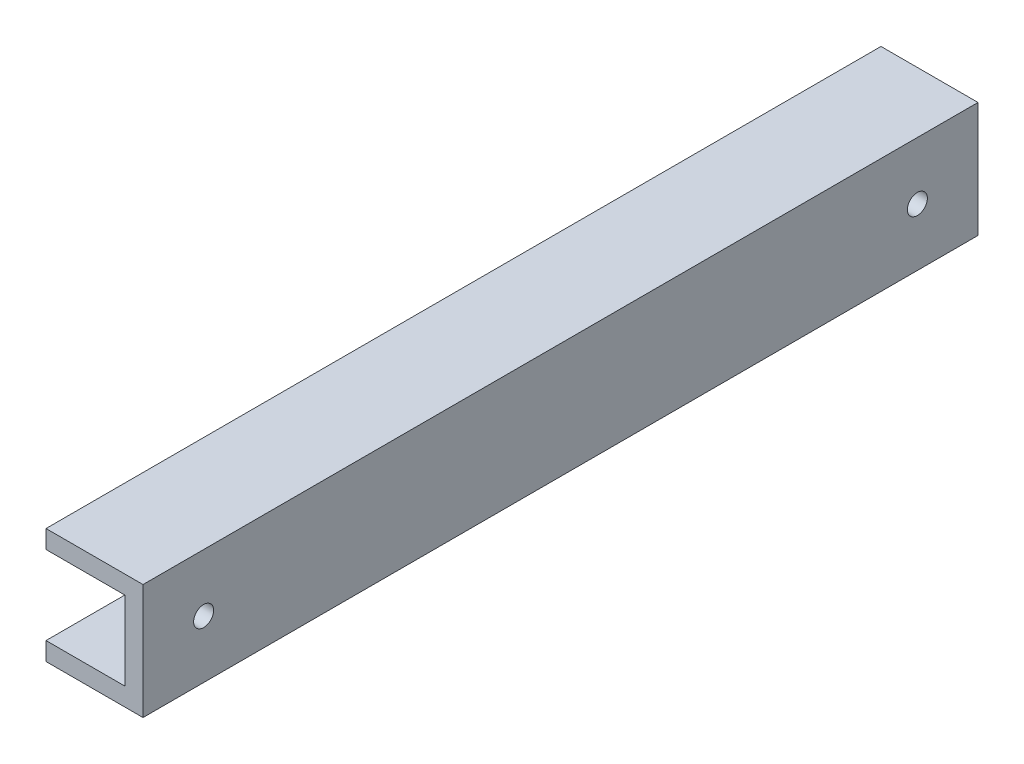
ISO-10303-21;
HEADER;
FILE_DESCRIPTION(('STEP AP214'),'2;1');
FILE_NAME('part.step','',(''),(''),'','','');
FILE_SCHEMA(('AUTOMOTIVE_DESIGN { 1 0 10303 214 1 1 1 1 }'));
ENDSEC;
DATA;
#1=APPLICATION_CONTEXT('core data for automotive mechanical design processes');
#2=APPLICATION_PROTOCOL_DEFINITION('international standard','automotive_design',2000,#1);
#3=PRODUCT_CONTEXT('',#1,'mechanical');
#4=PRODUCT('Part','Part','',(#3));
#5=PRODUCT_RELATED_PRODUCT_CATEGORY('part','',(#4));
#6=PRODUCT_DEFINITION_FORMATION('','',#4);
#7=PRODUCT_DEFINITION_CONTEXT('part definition',#1,'design');
#8=PRODUCT_DEFINITION('design','',#6,#7);
#9=PRODUCT_DEFINITION_SHAPE('','',#8);
#10=(LENGTH_UNIT() NAMED_UNIT(*) SI_UNIT(.MILLI.,.METRE.));
#11=(NAMED_UNIT(*) PLANE_ANGLE_UNIT() SI_UNIT($,.RADIAN.));
#12=(NAMED_UNIT(*) SI_UNIT($,.STERADIAN.) SOLID_ANGLE_UNIT());
#13=UNCERTAINTY_MEASURE_WITH_UNIT(LENGTH_MEASURE(1.E-05),#10,'distance_accuracy_value','');
#14=(GEOMETRIC_REPRESENTATION_CONTEXT(3) GLOBAL_UNCERTAINTY_ASSIGNED_CONTEXT((#13)) GLOBAL_UNIT_ASSIGNED_CONTEXT((#10,
#11,#12)) REPRESENTATION_CONTEXT('',''));
#15=CARTESIAN_POINT('',(0.,0.,0.));
#16=DIRECTION('',(0.,0.,1.));
#17=DIRECTION('',(1.,0.,0.));
#18=AXIS2_PLACEMENT_3D('',#15,#16,#17);
#19=CARTESIAN_POINT('',(3.,13.,23.));
#20=DIRECTION('',(0.,0.,1.));
#21=DIRECTION('',(0.,-1.,0.));
#22=AXIS2_PLACEMENT_3D('',#19,#20,#21);
#23=PLANE('',#22);
#24=DIRECTION('',(1.,0.,0.));
#25=VECTOR('',#24,1.);
#26=CARTESIAN_POINT('',(3.,13.,23.));
#27=LINE('',#26,#25);
#28=CARTESIAN_POINT('',(3.,13.,23.));
#29=VERTEX_POINT('',#28);
#30=CARTESIAN_POINT('',(9.,13.,23.));
#31=VERTEX_POINT('',#30);
#32=EDGE_CURVE('E237',#29,#31,#27,.T.);
#33=ORIENTED_EDGE('',*,*,#32,.T.);
#34=DIRECTION('',(0.,-1.,0.));
#35=VECTOR('',#34,1.);
#36=CARTESIAN_POINT('',(9.,13.,23.));
#37=LINE('',#36,#35);
#38=CARTESIAN_POINT('',(9.00000000000001,9.,23.));
#39=VERTEX_POINT('',#38);
#40=EDGE_CURVE('E71',#31,#39,#37,.T.);
#41=ORIENTED_EDGE('',*,*,#40,.T.);
#42=DIRECTION('',(-1.,0.,0.));
#43=VECTOR('',#42,1.);
#44=CARTESIAN_POINT('',(6.,9.,23.));
#45=LINE('',#44,#43);
#46=CARTESIAN_POINT('',(3.,9.,23.));
#47=VERTEX_POINT('',#46);
#48=EDGE_CURVE('E352',#39,#47,#45,.T.);
#49=ORIENTED_EDGE('',*,*,#48,.T.);
#50=DIRECTION('',(0.,-1.,0.));
#51=VECTOR('',#50,1.);
#52=CARTESIAN_POINT('',(3.,13.,23.));
#53=LINE('',#52,#51);
#54=EDGE_CURVE('E223',#29,#47,#53,.T.);
#55=ORIENTED_EDGE('',*,*,#54,.F.);
#56=EDGE_LOOP('',(#33,#41,#49,#55));
#57=FACE_BOUND('',#56,.T.);
#58=ADVANCED_FACE('F62',(#57),#23,.F.);
#59=CARTESIAN_POINT('',(3.,13.,114.7));
#60=DIRECTION('',(0.,0.,-1.));
#61=DIRECTION('',(-1.,0.,0.));
#62=AXIS2_PLACEMENT_3D('',#59,#60,#61);
#63=PLANE('',#62);
#64=DIRECTION('',(1.,0.,0.));
#65=VECTOR('',#64,1.);
#66=CARTESIAN_POINT('',(3.,0.,114.7));
#67=LINE('',#66,#65);
#68=CARTESIAN_POINT('',(3.,0.,114.7));
#69=VERTEX_POINT('',#68);
#70=CARTESIAN_POINT('',(9.,0.,114.7));
#71=VERTEX_POINT('',#70);
#72=EDGE_CURVE('E224',#69,#71,#67,.T.);
#73=ORIENTED_EDGE('',*,*,#72,.T.);
#74=DIRECTION('',(0.,1.,0.));
#75=VECTOR('',#74,1.);
#76=CARTESIAN_POINT('',(9.,13.,114.7));
#77=LINE('',#76,#75);
#78=CARTESIAN_POINT('',(9.00000000000002,4.,114.7));
#79=VERTEX_POINT('',#78);
#80=EDGE_CURVE('E334',#71,#79,#77,.T.);
#81=ORIENTED_EDGE('',*,*,#80,.T.);
#82=DIRECTION('',(-1.,0.,0.));
#83=VECTOR('',#82,1.);
#84=CARTESIAN_POINT('',(6.,4.,114.7));
#85=LINE('',#84,#83);
#86=CARTESIAN_POINT('',(3.,4.,114.7));
#87=VERTEX_POINT('',#86);
#88=EDGE_CURVE('E209',#79,#87,#85,.T.);
#89=ORIENTED_EDGE('',*,*,#88,.T.);
#90=DIRECTION('',(0.,1.,0.));
#91=VECTOR('',#90,1.);
#92=CARTESIAN_POINT('',(3.,13.,114.7));
#93=LINE('',#92,#91);
#94=EDGE_CURVE('E218',#69,#87,#93,.T.);
#95=ORIENTED_EDGE('',*,*,#94,.F.);
#96=EDGE_LOOP('',(#73,#81,#89,#95));
#97=FACE_BOUND('',#96,.T.);
#98=ADVANCED_FACE('F424',(#97),#63,.F.);
#99=CARTESIAN_POINT('',(3.,0.,0.));
#100=DIRECTION('',(-1.,0.,0.));
#101=DIRECTION('',(0.,0.,1.));
#102=AXIS2_PLACEMENT_3D('',#99,#100,#101);
#103=PLANE('',#102);
#104=DIRECTION('',(0.,0.,-1.));
#105=VECTOR('',#104,1.);
#106=CARTESIAN_POINT('',(3.,9.,23.));
#107=LINE('',#106,#105);
#108=CARTESIAN_POINT('',(3.,9.,114.7));
#109=VERTEX_POINT('',#108);
#110=EDGE_CURVE('E219',#109,#47,#107,.T.);
#111=ORIENTED_EDGE('',*,*,#110,.F.);
#112=CARTESIAN_POINT('',(3.,13.,114.7));
#113=VERTEX_POINT('',#112);
#114=EDGE_CURVE('E361',#109,#113,#93,.T.);
#115=ORIENTED_EDGE('',*,*,#114,.T.);
#116=DIRECTION('',(0.,0.,-1.));
#117=VECTOR('',#116,1.);
#118=CARTESIAN_POINT('',(3.,13.,23.));
#119=LINE('',#118,#117);
#120=EDGE_CURVE('E234',#113,#29,#119,.T.);
#121=ORIENTED_EDGE('',*,*,#120,.T.);
#122=ORIENTED_EDGE('',*,*,#54,.T.);
#123=EDGE_LOOP('',(#111,#115,#121,#122));
#124=FACE_BOUND('',#123,.T.);
#125=ADVANCED_FACE('F429',(#124),#103,.T.);
#126=CARTESIAN_POINT('',(0.,0.,137.7));
#127=DIRECTION('',(0.,1.,0.));
#128=DIRECTION('',(0.,0.,1.));
#129=AXIS2_PLACEMENT_3D('',#126,#127,#128);
#130=PLANE('',#129);
#131=DIRECTION('',(0.,0.,-1.));
#132=VECTOR('',#131,1.);
#133=CARTESIAN_POINT('',(13.,0.,137.7));
#134=LINE('',#133,#132);
#135=CARTESIAN_POINT('',(13.,0.,137.7));
#136=VERTEX_POINT('',#135);
#137=CARTESIAN_POINT('',(13.,0.,118.7));
#138=VERTEX_POINT('',#137);
#139=EDGE_CURVE('E285',#136,#138,#134,.T.);
#140=ORIENTED_EDGE('',*,*,#139,.T.);
#141=DIRECTION('',(-0.707106781186551,0.,-0.707106781186544));
#142=VECTOR('',#141,1.);
#143=CARTESIAN_POINT('',(15.9999999999999,0.,121.7));
#144=LINE('',#143,#142);
#145=EDGE_CURVE('E344',#138,#71,#144,.T.);
#146=ORIENTED_EDGE('',*,*,#145,.T.);
#147=ORIENTED_EDGE('',*,*,#72,.F.);
#148=DIRECTION('',(0.,0.,1.));
#149=VECTOR('',#148,1.);
#150=CARTESIAN_POINT('',(3.,0.,23.));
#151=LINE('',#150,#149);
#152=CARTESIAN_POINT('',(3.,0.,23.));
#153=VERTEX_POINT('',#152);
#154=EDGE_CURVE('E227',#153,#69,#151,.T.);
#155=ORIENTED_EDGE('',*,*,#154,.F.);
#156=DIRECTION('',(1.,0.,0.));
#157=VECTOR('',#156,1.);
#158=CARTESIAN_POINT('',(3.,0.,23.));
#159=LINE('',#158,#157);
#160=CARTESIAN_POINT('',(9.,0.,23.));
#161=VERTEX_POINT('',#160);
#162=EDGE_CURVE('E222',#153,#161,#159,.T.);
#163=ORIENTED_EDGE('',*,*,#162,.T.);
#164=DIRECTION('',(0.707106781186552,0.,-0.707106781186543));
#165=VECTOR('',#164,1.);
#166=CARTESIAN_POINT('',(-52.8500000000001,0.,84.8499999999993));
#167=LINE('',#166,#165);
#168=CARTESIAN_POINT('',(13.,0.,19.));
#169=VERTEX_POINT('',#168);
#170=EDGE_CURVE('E78',#161,#169,#167,.T.);
#171=ORIENTED_EDGE('',*,*,#170,.T.);
#172=CARTESIAN_POINT('',(13.,0.,0.));
#173=VERTEX_POINT('',#172);
#174=EDGE_CURVE('E284',#169,#173,#134,.T.);
#175=ORIENTED_EDGE('',*,*,#174,.T.);
#176=DIRECTION('',(1.,0.,0.));
#177=VECTOR('',#176,1.);
#178=CARTESIAN_POINT('',(0.,0.,0.));
#179=LINE('',#178,#177);
#180=CARTESIAN_POINT('',(0.,0.,0.));
#181=VERTEX_POINT('',#180);
#182=EDGE_CURVE('E260',#181,#173,#179,.T.);
#183=ORIENTED_EDGE('',*,*,#182,.F.);
#184=DIRECTION('',(0.,0.,-1.));
#185=VECTOR('',#184,1.);
#186=CARTESIAN_POINT('',(0.,0.,137.7));
#187=LINE('',#186,#185);
#188=CARTESIAN_POINT('',(0.,0.,137.7));
#189=VERTEX_POINT('',#188);
#190=EDGE_CURVE('E288',#189,#181,#187,.T.);
#191=ORIENTED_EDGE('',*,*,#190,.F.);
#192=DIRECTION('',(1.,0.,0.));
#193=VECTOR('',#192,1.);
#194=CARTESIAN_POINT('',(0.,0.,137.7));
#195=LINE('',#194,#193);
#196=EDGE_CURVE('E261',#189,#136,#195,.T.);
#197=ORIENTED_EDGE('',*,*,#196,.T.);
#198=EDGE_LOOP('',(#140,#146,#147,#155,#163,#171,#175,#183,#191,#197));
#199=FACE_BOUND('',#198,.T.);
#200=ADVANCED_FACE('F397',(#199),#130,.T.);
#201=CARTESIAN_POINT('',(13.,0.,137.7));
#202=DIRECTION('',(-1.,0.,0.));
#203=DIRECTION('',(0.,0.,1.));
#204=AXIS2_PLACEMENT_3D('',#201,#202,#203);
#205=PLANE('',#204);
#206=CARTESIAN_POINT('',(13.,6.5,127.7));
#207=DIRECTION('',(-1.,0.,0.));
#208=DIRECTION('',(0.,0.,1.));
#209=AXIS2_PLACEMENT_3D('',#206,#207,#208);
#210=CIRCLE('',#209,1.65000000000002);
#211=CARTESIAN_POINT('',(13.,6.5,129.35));
#212=VERTEX_POINT('',#211);
#213=EDGE_CURVE('E248',#212,#212,#210,.T.);
#214=ORIENTED_EDGE('',*,*,#213,.F.);
#215=EDGE_LOOP('',(#214));
#216=FACE_BOUND('',#215,.T.);
#217=DIRECTION('',(0.,0.,-1.));
#218=VECTOR('',#217,1.);
#219=CARTESIAN_POINT('',(13.,13.,137.7));
#220=LINE('',#219,#218);
#221=CARTESIAN_POINT('',(13.,13.,137.7));
#222=VERTEX_POINT('',#221);
#223=CARTESIAN_POINT('',(13.,13.,118.7));
#224=VERTEX_POINT('',#223);
#225=EDGE_CURVE('E281',#222,#224,#220,.T.);
#226=ORIENTED_EDGE('',*,*,#225,.T.);
#227=DIRECTION('',(0.,-1.,0.));
#228=VECTOR('',#227,1.);
#229=CARTESIAN_POINT('',(13.,0.,118.7));
#230=LINE('',#229,#228);
#231=EDGE_CURVE('E341',#224,#138,#230,.T.);
#232=ORIENTED_EDGE('',*,*,#231,.T.);
#233=ORIENTED_EDGE('',*,*,#139,.F.);
#234=DIRECTION('',(0.,1.,0.));
#235=VECTOR('',#234,1.);
#236=CARTESIAN_POINT('',(13.,0.,137.7));
#237=LINE('',#236,#235);
#238=EDGE_CURVE('E263',#136,#222,#237,.T.);
#239=ORIENTED_EDGE('',*,*,#238,.T.);
#240=EDGE_LOOP('',(#226,#232,#233,#239));
#241=FACE_BOUND('',#240,.T.);
#242=ADVANCED_FACE('F395',(#216,#241),#205,.T.);
#243=CARTESIAN_POINT('',(0.,13.,137.7));
#244=DIRECTION('',(0.,-1.,0.));
#245=DIRECTION('',(0.,0.,-1.));
#246=AXIS2_PLACEMENT_3D('',#243,#244,#245);
#247=PLANE('',#246);
#248=DIRECTION('',(1.,0.,0.));
#249=VECTOR('',#248,1.);
#250=CARTESIAN_POINT('',(3.,13.,114.7));
#251=LINE('',#250,#249);
#252=CARTESIAN_POINT('',(9.,13.,114.7));
#253=VERTEX_POINT('',#252);
#254=EDGE_CURVE('E229',#113,#253,#251,.T.);
#255=ORIENTED_EDGE('',*,*,#254,.T.);
#256=DIRECTION('',(0.707106781186551,0.,0.707106781186544));
#257=VECTOR('',#256,1.);
#258=CARTESIAN_POINT('',(15.9999999999999,13.,121.7));
#259=LINE('',#258,#257);
#260=EDGE_CURVE('E339',#253,#224,#259,.T.);
#261=ORIENTED_EDGE('',*,*,#260,.T.);
#262=ORIENTED_EDGE('',*,*,#225,.F.);
#263=DIRECTION('',(-1.,0.,0.));
#264=VECTOR('',#263,1.);
#265=CARTESIAN_POINT('',(0.,13.,137.7));
#266=LINE('',#265,#264);
#267=CARTESIAN_POINT('',(0.,13.,137.7));
#268=VERTEX_POINT('',#267);
#269=EDGE_CURVE('E267',#222,#268,#266,.T.);
#270=ORIENTED_EDGE('',*,*,#269,.T.);
#271=DIRECTION('',(0.,0.,-1.));
#272=VECTOR('',#271,1.);
#273=CARTESIAN_POINT('',(0.,13.,137.7));
#274=LINE('',#273,#272);
#275=CARTESIAN_POINT('',(0.,13.,0.));
#276=VERTEX_POINT('',#275);
#277=EDGE_CURVE('E270',#268,#276,#274,.T.);
#278=ORIENTED_EDGE('',*,*,#277,.T.);
#279=DIRECTION('',(-1.,0.,0.));
#280=VECTOR('',#279,1.);
#281=CARTESIAN_POINT('',(0.,13.,0.));
#282=LINE('',#281,#280);
#283=CARTESIAN_POINT('',(13.,13.,0.));
#284=VERTEX_POINT('',#283);
#285=EDGE_CURVE('E264',#284,#276,#282,.T.);
#286=ORIENTED_EDGE('',*,*,#285,.F.);
#287=CARTESIAN_POINT('',(13.,13.,19.));
#288=VERTEX_POINT('',#287);
#289=EDGE_CURVE('E280',#288,#284,#220,.T.);
#290=ORIENTED_EDGE('',*,*,#289,.F.);
#291=DIRECTION('',(-0.707106781186552,0.,0.707106781186543));
#292=VECTOR('',#291,1.);
#293=CARTESIAN_POINT('',(-52.8500000000001,13.,84.8499999999993));
#294=LINE('',#293,#292);
#295=EDGE_CURVE('E337',#288,#31,#294,.T.);
#296=ORIENTED_EDGE('',*,*,#295,.T.);
#297=ORIENTED_EDGE('',*,*,#32,.F.);
#298=ORIENTED_EDGE('',*,*,#120,.F.);
#299=EDGE_LOOP('',(#255,#261,#262,#270,#278,#286,#290,#296,#297,#298));
#300=FACE_BOUND('',#299,.T.);
#301=ADVANCED_FACE('F384',(#300),#247,.T.);
#302=CARTESIAN_POINT('',(13.,6.5,10.));
#303=DIRECTION('',(-1.,0.,0.));
#304=DIRECTION('',(0.,0.,1.));
#305=AXIS2_PLACEMENT_3D('',#302,#303,#304);
#306=CIRCLE('',#305,1.65);
#307=CARTESIAN_POINT('',(13.,6.5,11.65));
#308=VERTEX_POINT('',#307);
#309=EDGE_CURVE('E256',#308,#308,#306,.T.);
#310=ORIENTED_EDGE('',*,*,#309,.F.);
#311=EDGE_LOOP('',(#310));
#312=FACE_BOUND('',#311,.T.);
#313=ORIENTED_EDGE('',*,*,#174,.F.);
#314=DIRECTION('',(0.,1.,0.));
#315=VECTOR('',#314,1.);
#316=CARTESIAN_POINT('',(13.,0.,19.));
#317=LINE('',#316,#315);
#318=EDGE_CURVE('E12',#169,#288,#317,.T.);
#319=ORIENTED_EDGE('',*,*,#318,.T.);
#320=ORIENTED_EDGE('',*,*,#289,.T.);
#321=DIRECTION('',(0.,1.,0.));
#322=VECTOR('',#321,1.);
#323=CARTESIAN_POINT('',(13.,0.,0.));
#324=LINE('',#323,#322);
#325=EDGE_CURVE('E273',#173,#284,#324,.T.);
#326=ORIENTED_EDGE('',*,*,#325,.F.);
#327=EDGE_LOOP('',(#313,#319,#320,#326));
#328=FACE_BOUND('',#327,.T.);
#329=ADVANCED_FACE('F417',(#312,#328),#205,.T.);
#330=CARTESIAN_POINT('',(0.,0.,137.7));
#331=DIRECTION('',(0.,0.,1.));
#332=DIRECTION('',(1.,0.,0.));
#333=AXIS2_PLACEMENT_3D('',#330,#331,#332);
#334=PLANE('',#333);
#335=DIRECTION('',(-1.,0.,0.));
#336=VECTOR('',#335,1.);
#337=CARTESIAN_POINT('',(0.,16.,137.7));
#338=LINE('',#337,#336);
#339=CARTESIAN_POINT('',(16.,16.,137.7));
#340=VERTEX_POINT('',#339);
#341=CARTESIAN_POINT('',(0.,16.,137.7));
#342=VERTEX_POINT('',#341);
#343=EDGE_CURVE('E296',#340,#342,#338,.T.);
#344=ORIENTED_EDGE('',*,*,#343,.T.);
#345=DIRECTION('',(0.,-1.,0.));
#346=VECTOR('',#345,1.);
#347=CARTESIAN_POINT('',(0.,0.,137.7));
#348=LINE('',#347,#346);
#349=EDGE_CURVE('E244',#342,#268,#348,.T.);
#350=ORIENTED_EDGE('',*,*,#349,.T.);
#351=ORIENTED_EDGE('',*,*,#269,.F.);
#352=ORIENTED_EDGE('',*,*,#238,.F.);
#353=ORIENTED_EDGE('',*,*,#196,.F.);
#354=CARTESIAN_POINT('',(0.,-3.,137.7));
#355=VERTEX_POINT('',#354);
#356=EDGE_CURVE('E249',#189,#355,#348,.T.);
#357=ORIENTED_EDGE('',*,*,#356,.T.);
#358=DIRECTION('',(1.,0.,0.));
#359=VECTOR('',#358,1.);
#360=CARTESIAN_POINT('',(0.,-3.,137.7));
#361=LINE('',#360,#359);
#362=CARTESIAN_POINT('',(16.,-3.,137.7));
#363=VERTEX_POINT('',#362);
#364=EDGE_CURVE('E291',#355,#363,#361,.T.);
#365=ORIENTED_EDGE('',*,*,#364,.T.);
#366=DIRECTION('',(0.,1.,0.));
#367=VECTOR('',#366,1.);
#368=CARTESIAN_POINT('',(16.,0.,137.7));
#369=LINE('',#368,#367);
#370=EDGE_CURVE('E293',#363,#340,#369,.T.);
#371=ORIENTED_EDGE('',*,*,#370,.T.);
#372=EDGE_LOOP('',(#344,#350,#351,#352,#353,#357,#365,#371));
#373=FACE_BOUND('',#372,.T.);
#374=ADVANCED_FACE('F404',(#373),#334,.T.);
#375=CARTESIAN_POINT('',(0.,0.,0.));
#376=DIRECTION('',(0.,0.,1.));
#377=DIRECTION('',(1.,0.,0.));
#378=AXIS2_PLACEMENT_3D('',#375,#376,#377);
#379=PLANE('',#378);
#380=DIRECTION('',(0.,-1.,0.));
#381=VECTOR('',#380,1.);
#382=CARTESIAN_POINT('',(0.,0.,0.));
#383=LINE('',#382,#381);
#384=CARTESIAN_POINT('',(0.,16.,0.));
#385=VERTEX_POINT('',#384);
#386=EDGE_CURVE('E242',#385,#276,#383,.T.);
#387=ORIENTED_EDGE('',*,*,#386,.F.);
#388=DIRECTION('',(-1.,0.,0.));
#389=VECTOR('',#388,1.);
#390=CARTESIAN_POINT('',(0.,16.,0.));
#391=LINE('',#390,#389);
#392=CARTESIAN_POINT('',(16.,16.,0.));
#393=VERTEX_POINT('',#392);
#394=EDGE_CURVE('E294',#393,#385,#391,.T.);
#395=ORIENTED_EDGE('',*,*,#394,.F.);
#396=DIRECTION('',(0.,1.,0.));
#397=VECTOR('',#396,1.);
#398=CARTESIAN_POINT('',(16.,0.,0.));
#399=LINE('',#398,#397);
#400=CARTESIAN_POINT('',(16.,-3.,0.));
#401=VERTEX_POINT('',#400);
#402=EDGE_CURVE('E301',#401,#393,#399,.T.);
#403=ORIENTED_EDGE('',*,*,#402,.F.);
#404=DIRECTION('',(1.,0.,0.));
#405=VECTOR('',#404,1.);
#406=CARTESIAN_POINT('',(0.,-3.,0.));
#407=LINE('',#406,#405);
#408=CARTESIAN_POINT('',(0.,-3.,0.));
#409=VERTEX_POINT('',#408);
#410=EDGE_CURVE('E290',#409,#401,#407,.T.);
#411=ORIENTED_EDGE('',*,*,#410,.F.);
#412=EDGE_CURVE('E241',#181,#409,#383,.T.);
#413=ORIENTED_EDGE('',*,*,#412,.F.);
#414=ORIENTED_EDGE('',*,*,#182,.T.);
#415=ORIENTED_EDGE('',*,*,#325,.T.);
#416=ORIENTED_EDGE('',*,*,#285,.T.);
#417=EDGE_LOOP('',(#387,#395,#403,#411,#413,#414,#415,#416));
#418=FACE_BOUND('',#417,.T.);
#419=ADVANCED_FACE('F412',(#418),#379,.F.);
#420=CARTESIAN_POINT('',(0.,-3.,137.7));
#421=DIRECTION('',(0.,1.,0.));
#422=DIRECTION('',(0.,0.,1.));
#423=AXIS2_PLACEMENT_3D('',#420,#421,#422);
#424=PLANE('',#423);
#425=DIRECTION('',(0.,0.,1.));
#426=VECTOR('',#425,1.);
#427=CARTESIAN_POINT('',(0.,-3.,137.7));
#428=LINE('',#427,#426);
#429=EDGE_CURVE('E250',#409,#355,#428,.T.);
#430=ORIENTED_EDGE('',*,*,#429,.F.);
#431=ORIENTED_EDGE('',*,*,#410,.T.);
#432=DIRECTION('',(0.,0.,-1.));
#433=VECTOR('',#432,1.);
#434=CARTESIAN_POINT('',(16.,-3.,137.7));
#435=LINE('',#434,#433);
#436=EDGE_CURVE('E307',#363,#401,#435,.T.);
#437=ORIENTED_EDGE('',*,*,#436,.F.);
#438=ORIENTED_EDGE('',*,*,#364,.F.);
#439=EDGE_LOOP('',(#430,#431,#437,#438));
#440=FACE_BOUND('',#439,.T.);
#441=ADVANCED_FACE('F467',(#440),#424,.F.);
#442=CARTESIAN_POINT('',(0.,16.,137.7));
#443=DIRECTION('',(0.,-1.,0.));
#444=DIRECTION('',(0.,0.,-1.));
#445=AXIS2_PLACEMENT_3D('',#442,#443,#444);
#446=PLANE('',#445);
#447=DIRECTION('',(0.,0.,-1.));
#448=VECTOR('',#447,1.);
#449=CARTESIAN_POINT('',(0.,16.,137.7));
#450=LINE('',#449,#448);
#451=EDGE_CURVE('E245',#342,#385,#450,.T.);
#452=ORIENTED_EDGE('',*,*,#451,.F.);
#453=ORIENTED_EDGE('',*,*,#343,.F.);
#454=DIRECTION('',(0.,0.,-1.));
#455=VECTOR('',#454,1.);
#456=CARTESIAN_POINT('',(16.,16.,137.7));
#457=LINE('',#456,#455);
#458=EDGE_CURVE('E299',#340,#393,#457,.T.);
#459=ORIENTED_EDGE('',*,*,#458,.T.);
#460=ORIENTED_EDGE('',*,*,#394,.T.);
#461=EDGE_LOOP('',(#452,#453,#459,#460));
#462=FACE_BOUND('',#461,.T.);
#463=ADVANCED_FACE('F468',(#462),#446,.F.);
#464=CARTESIAN_POINT('',(16.,0.,137.7));
#465=DIRECTION('',(-1.,0.,0.));
#466=DIRECTION('',(0.,0.,1.));
#467=AXIS2_PLACEMENT_3D('',#464,#465,#466);
#468=PLANE('',#467);
#469=CARTESIAN_POINT('',(16.,6.5,10.));
#470=DIRECTION('',(-1.,0.,0.));
#471=DIRECTION('',(0.,0.,1.));
#472=AXIS2_PLACEMENT_3D('',#469,#470,#471);
#473=CIRCLE('',#472,1.65);
#474=CARTESIAN_POINT('',(16.,6.5,11.65));
#475=VERTEX_POINT('',#474);
#476=EDGE_CURVE('E257',#475,#475,#473,.T.);
#477=ORIENTED_EDGE('',*,*,#476,.T.);
#478=EDGE_LOOP('',(#477));
#479=FACE_BOUND('',#478,.T.);
#480=CARTESIAN_POINT('',(16.,6.5,127.7));
#481=DIRECTION('',(-1.,0.,0.));
#482=DIRECTION('',(0.,0.,1.));
#483=AXIS2_PLACEMENT_3D('',#480,#481,#482);
#484=CIRCLE('',#483,1.65000000000002);
#485=CARTESIAN_POINT('',(16.,6.5,129.35));
#486=VERTEX_POINT('',#485);
#487=EDGE_CURVE('E253',#486,#486,#484,.T.);
#488=ORIENTED_EDGE('',*,*,#487,.T.);
#489=EDGE_LOOP('',(#488));
#490=FACE_BOUND('',#489,.T.);
#491=ORIENTED_EDGE('',*,*,#402,.T.);
#492=ORIENTED_EDGE('',*,*,#458,.F.);
#493=ORIENTED_EDGE('',*,*,#370,.F.);
#494=ORIENTED_EDGE('',*,*,#436,.T.);
#495=EDGE_LOOP('',(#491,#492,#493,#494));
#496=FACE_BOUND('',#495,.T.);
#497=ADVANCED_FACE('F454',(#479,#490,#496),#468,.F.);
#498=CARTESIAN_POINT('',(27.,6.5,127.7));
#499=DIRECTION('',(-1.,0.,0.));
#500=DIRECTION('',(0.,0.,1.));
#501=AXIS2_PLACEMENT_3D('',#498,#499,#500);
#502=CYLINDRICAL_SURFACE('',#501,1.65000000000002);
#503=CARTESIAN_POINT('',(13.,6.5,129.35));
#504=CARTESIAN_POINT('',(13.03125,6.5,129.35));
#505=CARTESIAN_POINT('',(13.0625,6.5,129.35));
#506=CARTESIAN_POINT('',(13.125,6.5,129.35));
#507=CARTESIAN_POINT('',(13.15625,6.5,129.35));
#508=CARTESIAN_POINT('',(13.21875,6.5,129.35));
#509=CARTESIAN_POINT('',(13.25,6.5,129.35));
#510=CARTESIAN_POINT('',(13.3125,6.5,129.35));
#511=CARTESIAN_POINT('',(13.34375,6.5,129.35));
#512=CARTESIAN_POINT('',(13.40625,6.5,129.35));
#513=CARTESIAN_POINT('',(13.4375,6.5,129.35));
#514=CARTESIAN_POINT('',(13.5,6.5,129.35));
#515=CARTESIAN_POINT('',(13.53125,6.5,129.35));
#516=CARTESIAN_POINT('',(13.59375,6.5,129.35));
#517=CARTESIAN_POINT('',(13.625,6.5,129.35));
#518=CARTESIAN_POINT('',(13.6875,6.5,129.35));
#519=CARTESIAN_POINT('',(13.71875,6.5,129.35));
#520=CARTESIAN_POINT('',(13.78125,6.5,129.35));
#521=CARTESIAN_POINT('',(13.8125,6.5,129.35));
#522=CARTESIAN_POINT('',(13.875,6.5,129.35));
#523=CARTESIAN_POINT('',(13.90625,6.5,129.35));
#524=CARTESIAN_POINT('',(13.96875,6.5,129.35));
#525=CARTESIAN_POINT('',(14.,6.5,129.35));
#526=CARTESIAN_POINT('',(14.0625,6.5,129.35));
#527=CARTESIAN_POINT('',(14.09375,6.5,129.35));
#528=CARTESIAN_POINT('',(14.15625,6.5,129.35));
#529=CARTESIAN_POINT('',(14.1875,6.5,129.35));
#530=CARTESIAN_POINT('',(14.25,6.5,129.35));
#531=CARTESIAN_POINT('',(14.28125,6.5,129.35));
#532=CARTESIAN_POINT('',(14.34375,6.5,129.35));
#533=CARTESIAN_POINT('',(14.375,6.5,129.35));
#534=CARTESIAN_POINT('',(14.4375,6.5,129.35));
#535=CARTESIAN_POINT('',(14.46875,6.5,129.35));
#536=CARTESIAN_POINT('',(14.53125,6.5,129.35));
#537=CARTESIAN_POINT('',(14.5625,6.5,129.35));
#538=CARTESIAN_POINT('',(14.625,6.5,129.35));
#539=CARTESIAN_POINT('',(14.65625,6.5,129.35));
#540=CARTESIAN_POINT('',(14.71875,6.5,129.35));
#541=CARTESIAN_POINT('',(14.75,6.5,129.35));
#542=CARTESIAN_POINT('',(14.8125,6.5,129.35));
#543=CARTESIAN_POINT('',(14.84375,6.5,129.35));
#544=CARTESIAN_POINT('',(14.90625,6.5,129.35));
#545=CARTESIAN_POINT('',(14.9375,6.5,129.35));
#546=CARTESIAN_POINT('',(15.,6.5,129.35));
#547=CARTESIAN_POINT('',(15.03125,6.5,129.35));
#548=CARTESIAN_POINT('',(15.09375,6.5,129.35));
#549=CARTESIAN_POINT('',(15.125,6.5,129.35));
#550=CARTESIAN_POINT('',(15.1875,6.5,129.35));
#551=CARTESIAN_POINT('',(15.21875,6.5,129.35));
#552=CARTESIAN_POINT('',(15.28125,6.5,129.35));
#553=CARTESIAN_POINT('',(15.3125,6.5,129.35));
#554=CARTESIAN_POINT('',(15.375,6.5,129.35));
#555=CARTESIAN_POINT('',(15.40625,6.5,129.35));
#556=CARTESIAN_POINT('',(15.46875,6.5,129.35));
#557=CARTESIAN_POINT('',(15.5,6.5,129.35));
#558=CARTESIAN_POINT('',(15.5625,6.5,129.35));
#559=CARTESIAN_POINT('',(15.59375,6.5,129.35));
#560=CARTESIAN_POINT('',(15.65625,6.5,129.35));
#561=CARTESIAN_POINT('',(15.6875,6.5,129.35));
#562=CARTESIAN_POINT('',(15.75,6.5,129.35));
#563=CARTESIAN_POINT('',(15.78125,6.5,129.35));
#564=CARTESIAN_POINT('',(15.84375,6.5,129.35));
#565=CARTESIAN_POINT('',(15.875,6.5,129.35));
#566=CARTESIAN_POINT('',(15.9375,6.5,129.35));
#567=CARTESIAN_POINT('',(15.96875,6.5,129.35));
#568=CARTESIAN_POINT('',(16.,6.5,129.35));
#569=B_SPLINE_CURVE_WITH_KNOTS('',3,(#503,#504,#505,#506,#507,#508,#509,#510,#511,#512,#513,
#514,#515,#516,#517,#518,#519,#520,#521,#522,#523,#524,#525,#526,#527,#528,#529,#530,#531,#532,
#533,#534,#535,#536,#537,#538,#539,#540,#541,#542,#543,#544,#545,#546,#547,#548,#549,#550,#551,
#552,#553,#554,#555,#556,#557,#558,#559,#560,#561,#562,#563,#564,#565,#566,#567,#568),
.UNSPECIFIED.,.F.,.F.,(4,2,2,2,2,2,2,2,2,2,2,2,2,2,2,2,2,2,2,2,2,2,2,2,2,2,2,2,2,2,2,2,4),(0.,
0.0937500000000001,0.1875,0.28125,0.375,0.46875,0.5625,0.656250000000001,0.750000000000001,
0.843749999999999,0.937499999999999,1.03125,1.125,1.21875,1.3125,1.40625,1.5,1.59375,1.6875,
1.78125,1.875,1.96875,2.0625,2.15625,2.25,2.34375,2.4375,2.53125,2.625,2.71875,2.8125,2.90625,
3.),.UNSPECIFIED.);
#570=EDGE_CURVE('BSEAM450',#212,#486,#569,.T.);
#571=ORIENTED_EDGE('',*,*,#213,.T.);
#572=ORIENTED_EDGE('',*,*,#487,.F.);
#573=ORIENTED_EDGE('',*,*,#570,.T.);
#574=ORIENTED_EDGE('',*,*,#570,.F.);
#575=EDGE_LOOP('',(#571,#573,#572,#574));
#576=FACE_BOUND('',#575,.T.);
#577=ADVANCED_FACE('F450',(#576),#502,.F.);
#578=CARTESIAN_POINT('',(27.,6.5,10.));
#579=DIRECTION('',(-1.,0.,0.));
#580=DIRECTION('',(0.,0.,1.));
#581=AXIS2_PLACEMENT_3D('',#578,#579,#580);
#582=CYLINDRICAL_SURFACE('',#581,1.65);
#583=CARTESIAN_POINT('',(13.,6.5,11.65));
#584=CARTESIAN_POINT('',(13.03125,6.5,11.65));
#585=CARTESIAN_POINT('',(13.0625,6.5,11.65));
#586=CARTESIAN_POINT('',(13.125,6.5,11.65));
#587=CARTESIAN_POINT('',(13.15625,6.5,11.65));
#588=CARTESIAN_POINT('',(13.21875,6.5,11.65));
#589=CARTESIAN_POINT('',(13.25,6.5,11.65));
#590=CARTESIAN_POINT('',(13.3125,6.5,11.65));
#591=CARTESIAN_POINT('',(13.34375,6.5,11.65));
#592=CARTESIAN_POINT('',(13.40625,6.5,11.65));
#593=CARTESIAN_POINT('',(13.4375,6.5,11.65));
#594=CARTESIAN_POINT('',(13.5,6.5,11.65));
#595=CARTESIAN_POINT('',(13.53125,6.5,11.65));
#596=CARTESIAN_POINT('',(13.59375,6.5,11.65));
#597=CARTESIAN_POINT('',(13.625,6.5,11.65));
#598=CARTESIAN_POINT('',(13.6875,6.5,11.65));
#599=CARTESIAN_POINT('',(13.71875,6.5,11.65));
#600=CARTESIAN_POINT('',(13.78125,6.5,11.65));
#601=CARTESIAN_POINT('',(13.8125,6.5,11.65));
#602=CARTESIAN_POINT('',(13.875,6.5,11.65));
#603=CARTESIAN_POINT('',(13.90625,6.5,11.65));
#604=CARTESIAN_POINT('',(13.96875,6.5,11.65));
#605=CARTESIAN_POINT('',(14.,6.5,11.65));
#606=CARTESIAN_POINT('',(14.0625,6.5,11.65));
#607=CARTESIAN_POINT('',(14.09375,6.5,11.65));
#608=CARTESIAN_POINT('',(14.15625,6.5,11.65));
#609=CARTESIAN_POINT('',(14.1875,6.5,11.65));
#610=CARTESIAN_POINT('',(14.25,6.5,11.65));
#611=CARTESIAN_POINT('',(14.28125,6.5,11.65));
#612=CARTESIAN_POINT('',(14.34375,6.5,11.65));
#613=CARTESIAN_POINT('',(14.375,6.5,11.65));
#614=CARTESIAN_POINT('',(14.4375,6.5,11.65));
#615=CARTESIAN_POINT('',(14.46875,6.5,11.65));
#616=CARTESIAN_POINT('',(14.53125,6.5,11.65));
#617=CARTESIAN_POINT('',(14.5625,6.5,11.65));
#618=CARTESIAN_POINT('',(14.625,6.5,11.65));
#619=CARTESIAN_POINT('',(14.65625,6.5,11.65));
#620=CARTESIAN_POINT('',(14.71875,6.5,11.65));
#621=CARTESIAN_POINT('',(14.75,6.5,11.65));
#622=CARTESIAN_POINT('',(14.8125,6.5,11.65));
#623=CARTESIAN_POINT('',(14.84375,6.5,11.65));
#624=CARTESIAN_POINT('',(14.90625,6.5,11.65));
#625=CARTESIAN_POINT('',(14.9375,6.5,11.65));
#626=CARTESIAN_POINT('',(15.,6.5,11.65));
#627=CARTESIAN_POINT('',(15.03125,6.5,11.65));
#628=CARTESIAN_POINT('',(15.09375,6.5,11.65));
#629=CARTESIAN_POINT('',(15.125,6.5,11.65));
#630=CARTESIAN_POINT('',(15.1875,6.5,11.65));
#631=CARTESIAN_POINT('',(15.21875,6.5,11.65));
#632=CARTESIAN_POINT('',(15.28125,6.5,11.65));
#633=CARTESIAN_POINT('',(15.3125,6.5,11.65));
#634=CARTESIAN_POINT('',(15.375,6.5,11.65));
#635=CARTESIAN_POINT('',(15.40625,6.5,11.65));
#636=CARTESIAN_POINT('',(15.46875,6.5,11.65));
#637=CARTESIAN_POINT('',(15.5,6.5,11.65));
#638=CARTESIAN_POINT('',(15.5625,6.5,11.65));
#639=CARTESIAN_POINT('',(15.59375,6.5,11.65));
#640=CARTESIAN_POINT('',(15.65625,6.5,11.65));
#641=CARTESIAN_POINT('',(15.6875,6.5,11.65));
#642=CARTESIAN_POINT('',(15.75,6.5,11.65));
#643=CARTESIAN_POINT('',(15.78125,6.5,11.65));
#644=CARTESIAN_POINT('',(15.84375,6.5,11.65));
#645=CARTESIAN_POINT('',(15.875,6.5,11.65));
#646=CARTESIAN_POINT('',(15.9375,6.5,11.65));
#647=CARTESIAN_POINT('',(15.96875,6.5,11.65));
#648=CARTESIAN_POINT('',(16.,6.5,11.65));
#649=B_SPLINE_CURVE_WITH_KNOTS('',3,(#583,#584,#585,#586,#587,#588,#589,#590,#591,#592,#593,
#594,#595,#596,#597,#598,#599,#600,#601,#602,#603,#604,#605,#606,#607,#608,#609,#610,#611,#612,
#613,#614,#615,#616,#617,#618,#619,#620,#621,#622,#623,#624,#625,#626,#627,#628,#629,#630,#631,
#632,#633,#634,#635,#636,#637,#638,#639,#640,#641,#642,#643,#644,#645,#646,#647,#648),
.UNSPECIFIED.,.F.,.F.,(4,2,2,2,2,2,2,2,2,2,2,2,2,2,2,2,2,2,2,2,2,2,2,2,2,2,2,2,2,2,2,2,4),(0.,
0.0937500000000001,0.1875,0.28125,0.375,0.46875,0.5625,0.656250000000001,0.750000000000001,
0.843749999999999,0.937499999999999,1.03125,1.125,1.21875,1.3125,1.40625,1.5,1.59375,1.6875,
1.78125,1.875,1.96875,2.0625,2.15625,2.25,2.34375,2.4375,2.53125,2.625,2.71875,2.8125,2.90625,
3.),.UNSPECIFIED.);
#650=EDGE_CURVE('BSEAM446',#308,#475,#649,.T.);
#651=ORIENTED_EDGE('',*,*,#309,.T.);
#652=ORIENTED_EDGE('',*,*,#476,.F.);
#653=ORIENTED_EDGE('',*,*,#650,.T.);
#654=ORIENTED_EDGE('',*,*,#650,.F.);
#655=EDGE_LOOP('',(#651,#653,#652,#654));
#656=FACE_BOUND('',#655,.T.);
#657=ADVANCED_FACE('F446',(#656),#582,.F.);
#658=CARTESIAN_POINT('',(0.,0.,0.));
#659=DIRECTION('',(-1.,0.,0.));
#660=DIRECTION('',(0.,0.,1.));
#661=AXIS2_PLACEMENT_3D('',#658,#659,#660);
#662=PLANE('',#661);
#663=ORIENTED_EDGE('',*,*,#451,.T.);
#664=ORIENTED_EDGE('',*,*,#386,.T.);
#665=ORIENTED_EDGE('',*,*,#277,.F.);
#666=ORIENTED_EDGE('',*,*,#349,.F.);
#667=EDGE_LOOP('',(#663,#664,#665,#666));
#668=FACE_BOUND('',#667,.T.);
#669=ADVANCED_FACE('F441',(#668),#662,.T.);
#670=ORIENTED_EDGE('',*,*,#429,.T.);
#671=ORIENTED_EDGE('',*,*,#356,.F.);
#672=ORIENTED_EDGE('',*,*,#190,.T.);
#673=ORIENTED_EDGE('',*,*,#412,.T.);
#674=EDGE_LOOP('',(#670,#671,#672,#673));
#675=FACE_BOUND('',#674,.T.);
#676=ADVANCED_FACE('F436',(#675),#662,.T.);
#677=DIRECTION('',(-1.,0.,0.));
#678=VECTOR('',#677,1.);
#679=CARTESIAN_POINT('',(6.,4.,23.));
#680=LINE('',#679,#678);
#681=CARTESIAN_POINT('',(9.00000000000001,4.,23.));
#682=VERTEX_POINT('',#681);
#683=CARTESIAN_POINT('',(3.,4.,23.));
#684=VERTEX_POINT('',#683);
#685=EDGE_CURVE('E199',#682,#684,#680,.T.);
#686=ORIENTED_EDGE('',*,*,#685,.F.);
#687=DIRECTION('',(0.,-1.,0.));
#688=VECTOR('',#687,1.);
#689=CARTESIAN_POINT('',(9.,13.,23.));
#690=LINE('',#689,#688);
#691=EDGE_CURVE('E86',#682,#161,#690,.T.);
#692=ORIENTED_EDGE('',*,*,#691,.T.);
#693=ORIENTED_EDGE('',*,*,#162,.F.);
#694=EDGE_CURVE('E215',#684,#153,#53,.T.);
#695=ORIENTED_EDGE('',*,*,#694,.F.);
#696=EDGE_LOOP('',(#686,#692,#693,#695));
#697=FACE_BOUND('',#696,.T.);
#698=ADVANCED_FACE('F221',(#697),#23,.F.);
#699=DIRECTION('',(0.,0.,1.));
#700=VECTOR('',#699,1.);
#701=CARTESIAN_POINT('',(3.,4.,23.));
#702=LINE('',#701,#700);
#703=EDGE_CURVE('E203',#684,#87,#702,.T.);
#704=ORIENTED_EDGE('',*,*,#703,.F.);
#705=ORIENTED_EDGE('',*,*,#694,.T.);
#706=ORIENTED_EDGE('',*,*,#154,.T.);
#707=ORIENTED_EDGE('',*,*,#94,.T.);
#708=EDGE_LOOP('',(#704,#705,#706,#707));
#709=FACE_BOUND('',#708,.T.);
#710=ADVANCED_FACE('F214',(#709),#103,.T.);
#711=DIRECTION('',(-1.,0.,0.));
#712=VECTOR('',#711,1.);
#713=CARTESIAN_POINT('',(6.,9.,114.7));
#714=LINE('',#713,#712);
#715=CARTESIAN_POINT('',(9.00000000000002,9.,114.7));
#716=VERTEX_POINT('',#715);
#717=EDGE_CURVE('E362',#716,#109,#714,.T.);
#718=ORIENTED_EDGE('',*,*,#717,.F.);
#719=DIRECTION('',(0.,1.,0.));
#720=VECTOR('',#719,1.);
#721=CARTESIAN_POINT('',(9.,13.,114.7));
#722=LINE('',#721,#720);
#723=EDGE_CURVE('E332',#716,#253,#722,.T.);
#724=ORIENTED_EDGE('',*,*,#723,.T.);
#725=ORIENTED_EDGE('',*,*,#254,.F.);
#726=ORIENTED_EDGE('',*,*,#114,.F.);
#727=EDGE_LOOP('',(#718,#724,#725,#726));
#728=FACE_BOUND('',#727,.T.);
#729=ADVANCED_FACE('F432',(#728),#63,.F.);
#730=CARTESIAN_POINT('',(6.,9.,23.));
#731=DIRECTION('',(0.,1.,0.));
#732=DIRECTION('',(0.,0.,1.));
#733=AXIS2_PLACEMENT_3D('',#730,#731,#732);
#734=PLANE('',#733);
#735=ORIENTED_EDGE('',*,*,#110,.T.);
#736=ORIENTED_EDGE('',*,*,#48,.F.);
#737=DIRECTION('',(-0.707106781186548,0.,0.707106781186547));
#738=VECTOR('',#737,1.);
#739=CARTESIAN_POINT('',(7.5,9.,24.5));
#740=LINE('',#739,#738);
#741=CARTESIAN_POINT('',(6.,9.,26.));
#742=VERTEX_POINT('',#741);
#743=EDGE_CURVE('E330',#39,#742,#740,.T.);
#744=ORIENTED_EDGE('',*,*,#743,.T.);
#745=DIRECTION('',(0.,0.,-1.));
#746=VECTOR('',#745,1.);
#747=CARTESIAN_POINT('',(6.,9.,23.));
#748=LINE('',#747,#746);
#749=CARTESIAN_POINT('',(6.,9.,111.7));
#750=VERTEX_POINT('',#749);
#751=EDGE_CURVE('E210',#750,#742,#748,.T.);
#752=ORIENTED_EDGE('',*,*,#751,.F.);
#753=DIRECTION('',(0.707106781186549,0.,0.707106781186546));
#754=VECTOR('',#753,1.);
#755=CARTESIAN_POINT('',(-38.35,9.,67.3500000000002));
#756=LINE('',#755,#754);
#757=EDGE_CURVE('E324',#750,#716,#756,.T.);
#758=ORIENTED_EDGE('',*,*,#757,.T.);
#759=ORIENTED_EDGE('',*,*,#717,.T.);
#760=EDGE_LOOP('',(#735,#736,#744,#752,#758,#759));
#761=FACE_BOUND('',#760,.T.);
#762=ADVANCED_FACE('F357',(#761),#734,.F.);
#763=CARTESIAN_POINT('',(6.,4.,23.));
#764=DIRECTION('',(0.,-1.,0.));
#765=DIRECTION('',(0.,0.,-1.));
#766=AXIS2_PLACEMENT_3D('',#763,#764,#765);
#767=PLANE('',#766);
#768=ORIENTED_EDGE('',*,*,#703,.T.);
#769=ORIENTED_EDGE('',*,*,#88,.F.);
#770=DIRECTION('',(-0.707106781186549,0.,-0.707106781186546));
#771=VECTOR('',#770,1.);
#772=CARTESIAN_POINT('',(-38.35,4.,67.3500000000002));
#773=LINE('',#772,#771);
#774=CARTESIAN_POINT('',(6.,4.,111.7));
#775=VERTEX_POINT('',#774);
#776=EDGE_CURVE('E327',#79,#775,#773,.T.);
#777=ORIENTED_EDGE('',*,*,#776,.T.);
#778=DIRECTION('',(0.,0.,1.));
#779=VECTOR('',#778,1.);
#780=CARTESIAN_POINT('',(6.,4.,23.));
#781=LINE('',#780,#779);
#782=CARTESIAN_POINT('',(6.,4.,26.));
#783=VERTEX_POINT('',#782);
#784=EDGE_CURVE('E370',#783,#775,#781,.T.);
#785=ORIENTED_EDGE('',*,*,#784,.F.);
#786=DIRECTION('',(0.707106781186548,0.,-0.707106781186547));
#787=VECTOR('',#786,1.);
#788=CARTESIAN_POINT('',(7.50000000000001,4.,24.5));
#789=LINE('',#788,#787);
#790=EDGE_CURVE('E206',#783,#682,#789,.T.);
#791=ORIENTED_EDGE('',*,*,#790,.T.);
#792=ORIENTED_EDGE('',*,*,#685,.T.);
#793=EDGE_LOOP('',(#768,#769,#777,#785,#791,#792));
#794=FACE_BOUND('',#793,.T.);
#795=ADVANCED_FACE('F201',(#794),#767,.F.);
#796=CARTESIAN_POINT('',(6.,0.,0.));
#797=DIRECTION('',(-1.,0.,0.));
#798=DIRECTION('',(0.,0.,1.));
#799=AXIS2_PLACEMENT_3D('',#796,#797,#798);
#800=PLANE('',#799);
#801=ORIENTED_EDGE('',*,*,#784,.T.);
#802=DIRECTION('',(0.,1.,0.));
#803=VECTOR('',#802,1.);
#804=CARTESIAN_POINT('',(6.,9.,111.7));
#805=LINE('',#804,#803);
#806=EDGE_CURVE('E317',#775,#750,#805,.T.);
#807=ORIENTED_EDGE('',*,*,#806,.T.);
#808=ORIENTED_EDGE('',*,*,#751,.T.);
#809=DIRECTION('',(0.,-1.,0.));
#810=VECTOR('',#809,1.);
#811=CARTESIAN_POINT('',(6.,4.,26.));
#812=LINE('',#811,#810);
#813=EDGE_CURVE('E310',#742,#783,#812,.T.);
#814=ORIENTED_EDGE('',*,*,#813,.T.);
#815=EDGE_LOOP('',(#801,#807,#808,#814));
#816=FACE_BOUND('',#815,.T.);
#817=ADVANCED_FACE('F369',(#816),#800,.T.);
#818=CARTESIAN_POINT('',(6.,0.,111.7));
#819=DIRECTION('',(-0.707106781186546,0.,0.707106781186549));
#820=DIRECTION('',(0.,-1.,0.));
#821=AXIS2_PLACEMENT_3D('',#818,#819,#820);
#822=PLANE('',#821);
#823=ORIENTED_EDGE('',*,*,#776,.F.);
#824=DIRECTION('',(0.,-1.,0.));
#825=VECTOR('',#824,1.);
#826=CARTESIAN_POINT('',(9.00000000000002,4.,114.7));
#827=LINE('',#826,#825);
#828=EDGE_CURVE('E320',#716,#79,#827,.T.);
#829=ORIENTED_EDGE('',*,*,#828,.F.);
#830=ORIENTED_EDGE('',*,*,#757,.F.);
#831=ORIENTED_EDGE('',*,*,#806,.F.);
#832=EDGE_LOOP('',(#823,#829,#830,#831));
#833=FACE_BOUND('',#832,.T.);
#834=ADVANCED_FACE('F479',(#833),#822,.T.);
#835=CARTESIAN_POINT('',(6.,0.,26.));
#836=DIRECTION('',(-0.707106781186547,0.,-0.707106781186548));
#837=DIRECTION('',(0.,1.,0.));
#838=AXIS2_PLACEMENT_3D('',#835,#836,#837);
#839=PLANE('',#838);
#840=ORIENTED_EDGE('',*,*,#743,.F.);
#841=DIRECTION('',(0.,1.,0.));
#842=VECTOR('',#841,1.);
#843=CARTESIAN_POINT('',(9.00000000000001,9.,23.));
#844=LINE('',#843,#842);
#845=EDGE_CURVE('E322',#682,#39,#844,.T.);
#846=ORIENTED_EDGE('',*,*,#845,.F.);
#847=ORIENTED_EDGE('',*,*,#790,.F.);
#848=ORIENTED_EDGE('',*,*,#813,.F.);
#849=EDGE_LOOP('',(#840,#846,#847,#848));
#850=FACE_BOUND('',#849,.T.);
#851=ADVANCED_FACE('F366',(#850),#839,.T.);
#852=CARTESIAN_POINT('',(9.,13.,114.7));
#853=DIRECTION('',(0.707106781186544,0.,-0.707106781186551));
#854=DIRECTION('',(0.,1.,0.));
#855=AXIS2_PLACEMENT_3D('',#852,#853,#854);
#856=PLANE('',#855);
#857=ORIENTED_EDGE('',*,*,#145,.F.);
#858=ORIENTED_EDGE('',*,*,#231,.F.);
#859=ORIENTED_EDGE('',*,*,#260,.F.);
#860=ORIENTED_EDGE('',*,*,#723,.F.);
#861=ORIENTED_EDGE('',*,*,#828,.T.);
#862=ORIENTED_EDGE('',*,*,#80,.F.);
#863=EDGE_LOOP('',(#857,#858,#859,#860,#861,#862));
#864=FACE_BOUND('',#863,.T.);
#865=ADVANCED_FACE('F391',(#864),#856,.F.);
#866=CARTESIAN_POINT('',(9.,13.,23.));
#867=DIRECTION('',(0.707106781186543,0.,0.707106781186552));
#868=DIRECTION('',(0.,-1.,0.));
#869=AXIS2_PLACEMENT_3D('',#866,#867,#868);
#870=PLANE('',#869);
#871=ORIENTED_EDGE('',*,*,#295,.F.);
#872=ORIENTED_EDGE('',*,*,#318,.F.);
#873=ORIENTED_EDGE('',*,*,#170,.F.);
#874=ORIENTED_EDGE('',*,*,#691,.F.);
#875=ORIENTED_EDGE('',*,*,#845,.T.);
#876=ORIENTED_EDGE('',*,*,#40,.F.);
#877=EDGE_LOOP('',(#871,#872,#873,#874,#875,#876));
#878=FACE_BOUND('',#877,.T.);
#879=ADVANCED_FACE('F65',(#878),#870,.F.);
#880=CLOSED_SHELL('',(#58,#98,#125,#200,#242,#301,#329,#374,#419,#441,#463,#497,#577,#657,#669,
#676,#698,#710,#729,#762,#795,#817,#834,#851,#865,#879));
#881=MANIFOLD_SOLID_BREP('B2',#880);
#882=ADVANCED_BREP_SHAPE_REPRESENTATION('',(#18,#881),#14);
#883=SHAPE_DEFINITION_REPRESENTATION(#9,#882);
ENDSEC;
END-ISO-10303-21;
